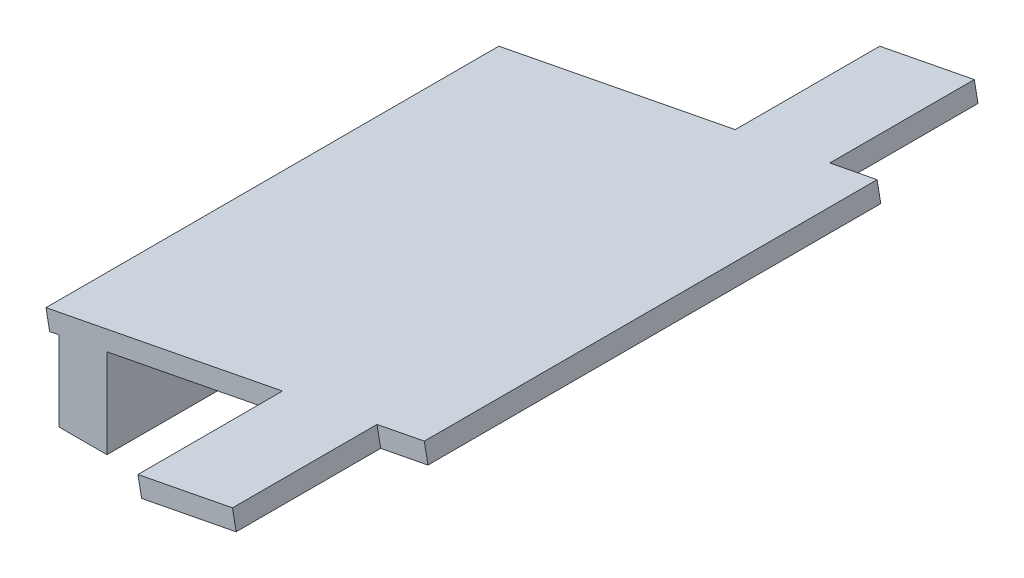
ISO-10303-21;
HEADER;
FILE_DESCRIPTION(('STEP AP214'),'2;1');
FILE_NAME('part.step','',(''),(''),'','','');
FILE_SCHEMA(('AUTOMOTIVE_DESIGN { 1 0 10303 214 1 1 1 1 }'));
ENDSEC;
DATA;
#1=APPLICATION_CONTEXT('core data for automotive mechanical design processes');
#2=APPLICATION_PROTOCOL_DEFINITION('international standard','automotive_design',2000,#1);
#3=PRODUCT_CONTEXT('',#1,'mechanical');
#4=PRODUCT('Part','Part','',(#3));
#5=PRODUCT_RELATED_PRODUCT_CATEGORY('part','',(#4));
#6=PRODUCT_DEFINITION_FORMATION('','',#4);
#7=PRODUCT_DEFINITION_CONTEXT('part definition',#1,'design');
#8=PRODUCT_DEFINITION('design','',#6,#7);
#9=PRODUCT_DEFINITION_SHAPE('','',#8);
#10=(LENGTH_UNIT() NAMED_UNIT(*) SI_UNIT(.MILLI.,.METRE.));
#11=(NAMED_UNIT(*) PLANE_ANGLE_UNIT() SI_UNIT($,.RADIAN.));
#12=(NAMED_UNIT(*) SI_UNIT($,.STERADIAN.) SOLID_ANGLE_UNIT());
#13=UNCERTAINTY_MEASURE_WITH_UNIT(LENGTH_MEASURE(1.E-05),#10,'distance_accuracy_value','');
#14=(GEOMETRIC_REPRESENTATION_CONTEXT(3) GLOBAL_UNCERTAINTY_ASSIGNED_CONTEXT((#13)) GLOBAL_UNIT_ASSIGNED_CONTEXT((#10,
#11,#12)) REPRESENTATION_CONTEXT('',''));
#15=CARTESIAN_POINT('',(0.,0.,0.));
#16=DIRECTION('',(0.,0.,1.));
#17=DIRECTION('',(1.,0.,0.));
#18=AXIS2_PLACEMENT_3D('',#15,#16,#17);
#19=CARTESIAN_POINT('',(-11.9247675422272,-2.08024959402573,-22.7767897226619));
#20=DIRECTION('',(0.,0.,-1.));
#21=DIRECTION('',(-0.98162718344752,-0.190808995377284,0.));
#22=AXIS2_PLACEMENT_3D('',#19,#20,#21);
#23=PLANE('',#22);
#24=DIRECTION('',(0.98162718344752,0.190808995377284,0.));
#25=VECTOR('',#24,1.);
#26=CARTESIAN_POINT('',(-11.5431495514726,-4.04350396092077,-22.7767897226619));
#27=LINE('',#26,#25);
#28=CARTESIAN_POINT('',(22.8138018691906,2.63481087728417,-22.7767897226619));
#29=VERTEX_POINT('',#28);
#30=CARTESIAN_POINT('',(27.7219377864282,3.58885585417059,-22.7767897226618));
#31=VERTEX_POINT('',#30);
#32=EDGE_CURVE('E180',#29,#31,#27,.T.);
#33=ORIENTED_EDGE('',*,*,#32,.F.);
#34=DIRECTION('',(-0.190808995377284,0.98162718344752,0.));
#35=VECTOR('',#34,1.);
#36=CARTESIAN_POINT('',(22.8138018691906,2.63481087728417,-22.7767897226619));
#37=LINE('',#36,#35);
#38=CARTESIAN_POINT('',(22.432183878436,4.5980652441792,-22.7767897226619));
#39=VERTEX_POINT('',#38);
#40=EDGE_CURVE('E171',#29,#39,#37,.T.);
#41=ORIENTED_EDGE('',*,*,#40,.T.);
#42=DIRECTION('',(0.98162718344752,0.190808995377284,0.));
#43=VECTOR('',#42,1.);
#44=CARTESIAN_POINT('',(-11.9247675422272,-2.08024959402573,-22.7767897226619));
#45=LINE('',#44,#43);
#46=CARTESIAN_POINT('',(27.3403197956736,5.55211022106563,-22.7767897226618));
#47=VERTEX_POINT('',#46);
#48=EDGE_CURVE('E195',#39,#47,#45,.T.);
#49=ORIENTED_EDGE('',*,*,#48,.T.);
#50=DIRECTION('',(0.190808995377284,-0.98162718344752,0.));
#51=VECTOR('',#50,1.);
#52=CARTESIAN_POINT('',(27.3403197956736,5.55211022106563,-22.7767897226618));
#53=LINE('',#52,#51);
#54=EDGE_CURVE('E205',#47,#31,#53,.T.);
#55=ORIENTED_EDGE('',*,*,#54,.T.);
#56=EDGE_LOOP('',(#33,#41,#49,#55));
#57=FACE_BOUND('',#56,.T.);
#58=ADVANCED_FACE('F39',(#57),#23,.T.);
#59=CARTESIAN_POINT('',(-11.9247675422272,-2.08024959402573,24.2232102773381));
#60=DIRECTION('',(0.,0.,-1.));
#61=DIRECTION('',(-0.98162718344752,-0.190808995377284,0.));
#62=AXIS2_PLACEMENT_3D('',#59,#60,#61);
#63=PLANE('',#62);
#64=DIRECTION('',(-0.190808995377284,0.98162718344752,0.));
#65=VECTOR('',#64,1.);
#66=CARTESIAN_POINT('',(22.8138018691906,2.63481087728417,24.2232102773381));
#67=LINE('',#66,#65);
#68=CARTESIAN_POINT('',(22.8138018691906,2.63481087728417,24.2232102773381));
#69=VERTEX_POINT('',#68);
#70=CARTESIAN_POINT('',(22.432183878436,4.59806524417921,24.2232102773381));
#71=VERTEX_POINT('',#70);
#72=EDGE_CURVE('E302',#69,#71,#67,.T.);
#73=ORIENTED_EDGE('',*,*,#72,.F.);
#74=DIRECTION('',(0.98162718344752,0.190808995377284,0.));
#75=VECTOR('',#74,1.);
#76=CARTESIAN_POINT('',(-11.5431495514726,-4.04350396092077,24.2232102773381));
#77=LINE('',#76,#75);
#78=CARTESIAN_POINT('',(27.7219377864282,3.58885585417059,24.2232102773381));
#79=VERTEX_POINT('',#78);
#80=EDGE_CURVE('E183',#69,#79,#77,.T.);
#81=ORIENTED_EDGE('',*,*,#80,.T.);
#82=DIRECTION('',(0.190808995377284,-0.98162718344752,0.));
#83=VECTOR('',#82,1.);
#84=CARTESIAN_POINT('',(27.3403197956737,5.55211022106563,24.2232102773381));
#85=LINE('',#84,#83);
#86=CARTESIAN_POINT('',(27.3403197956737,5.55211022106563,24.2232102773381));
#87=VERTEX_POINT('',#86);
#88=EDGE_CURVE('E202',#87,#79,#85,.T.);
#89=ORIENTED_EDGE('',*,*,#88,.F.);
#90=DIRECTION('',(0.98162718344752,0.190808995377284,0.));
#91=VECTOR('',#90,1.);
#92=CARTESIAN_POINT('',(-11.9247675422272,-2.08024959402573,24.2232102773381));
#93=LINE('',#92,#91);
#94=EDGE_CURVE('E251',#71,#87,#93,.T.);
#95=ORIENTED_EDGE('',*,*,#94,.F.);
#96=EDGE_LOOP('',(#73,#81,#89,#95));
#97=FACE_BOUND('',#96,.T.);
#98=ADVANCED_FACE('F267',(#97),#63,.F.);
#99=DIRECTION('',(-0.190808995377284,0.98162718344752,0.));
#100=VECTOR('',#99,1.);
#101=CARTESIAN_POINT('',(12.9975300347154,0.726720923511325,-22.7767897226619));
#102=LINE('',#101,#100);
#103=CARTESIAN_POINT('',(12.9975300347154,0.726720923511325,-22.7767897226619));
#104=VERTEX_POINT('',#103);
#105=CARTESIAN_POINT('',(12.6159120439608,2.68997529040637,-22.7767897226619));
#106=VERTEX_POINT('',#105);
#107=EDGE_CURVE('E155',#104,#106,#102,.T.);
#108=ORIENTED_EDGE('',*,*,#107,.F.);
#109=CARTESIAN_POINT('',(-11.5431495514726,-4.04350396092077,-22.7767897226619));
#110=VERTEX_POINT('',#109);
#111=EDGE_CURVE('E168',#110,#104,#27,.T.);
#112=ORIENTED_EDGE('',*,*,#111,.F.);
#113=DIRECTION('',(0.190808995377284,-0.98162718344752,0.));
#114=VECTOR('',#113,1.);
#115=CARTESIAN_POINT('',(-11.9247675422272,-2.08024959402573,-22.7767897226619));
#116=LINE('',#115,#114);
#117=CARTESIAN_POINT('',(-11.9247675422272,-2.08024959402573,-22.7767897226619));
#118=VERTEX_POINT('',#117);
#119=EDGE_CURVE('E196',#118,#110,#116,.T.);
#120=ORIENTED_EDGE('',*,*,#119,.F.);
#121=EDGE_CURVE('E170',#118,#106,#45,.T.);
#122=ORIENTED_EDGE('',*,*,#121,.T.);
#123=EDGE_LOOP('',(#108,#112,#120,#122));
#124=FACE_BOUND('',#123,.T.);
#125=ADVANCED_FACE('F41',(#124),#23,.T.);
#126=CARTESIAN_POINT('',(-11.9247675422272,-2.08024959402573,-22.7767897226619));
#127=DIRECTION('',(0.98162718344752,0.190808995377284,0.));
#128=DIRECTION('',(0.,0.,-1.));
#129=AXIS2_PLACEMENT_3D('',#126,#127,#128);
#130=PLANE('',#129);
#131=DIRECTION('',(0.,0.,1.));
#132=VECTOR('',#131,1.);
#133=CARTESIAN_POINT('',(-11.5431495514726,-4.04350396092077,-22.7767897226619));
#134=LINE('',#133,#132);
#135=CARTESIAN_POINT('',(-11.5431495514726,-4.04350396092077,24.2232102773381));
#136=VERTEX_POINT('',#135);
#137=EDGE_CURVE('E178',#110,#136,#134,.T.);
#138=ORIENTED_EDGE('',*,*,#137,.T.);
#139=DIRECTION('',(0.190808995377284,-0.98162718344752,0.));
#140=VECTOR('',#139,1.);
#141=CARTESIAN_POINT('',(-11.9247675422272,-2.08024959402573,24.2232102773381));
#142=LINE('',#141,#140);
#143=CARTESIAN_POINT('',(-11.9247675422272,-2.08024959402573,24.2232102773381));
#144=VERTEX_POINT('',#143);
#145=EDGE_CURVE('E199',#144,#136,#142,.T.);
#146=ORIENTED_EDGE('',*,*,#145,.F.);
#147=DIRECTION('',(0.,0.,1.));
#148=VECTOR('',#147,1.);
#149=CARTESIAN_POINT('',(-11.9247675422272,-2.08024959402573,-22.7767897226619));
#150=LINE('',#149,#148);
#151=EDGE_CURVE('E187',#118,#144,#150,.T.);
#152=ORIENTED_EDGE('',*,*,#151,.F.);
#153=ORIENTED_EDGE('',*,*,#119,.T.);
#154=EDGE_LOOP('',(#138,#146,#152,#153));
#155=FACE_BOUND('',#154,.T.);
#156=ADVANCED_FACE('F327',(#155),#130,.F.);
#157=CARTESIAN_POINT('',(-5.59623768797089,-2.8875413944739,24.2232102773381));
#158=VERTEX_POINT('',#157);
#159=CARTESIAN_POINT('',(12.9975300347154,0.726720923511325,24.2232102773381));
#160=VERTEX_POINT('',#159);
#161=EDGE_CURVE('E193',#158,#160,#77,.T.);
#162=ORIENTED_EDGE('',*,*,#161,.T.);
#163=DIRECTION('',(-0.190808995377284,0.98162718344752,0.));
#164=VECTOR('',#163,1.);
#165=CARTESIAN_POINT('',(12.9975300347154,0.726720923511325,24.2232102773381));
#166=LINE('',#165,#164);
#167=CARTESIAN_POINT('',(12.6159120439608,2.68997529040637,24.2232102773381));
#168=VERTEX_POINT('',#167);
#169=EDGE_CURVE('E244',#160,#168,#166,.T.);
#170=ORIENTED_EDGE('',*,*,#169,.T.);
#171=EDGE_CURVE('E252',#144,#168,#93,.T.);
#172=ORIENTED_EDGE('',*,*,#171,.F.);
#173=ORIENTED_EDGE('',*,*,#145,.T.);
#174=CARTESIAN_POINT('',(-10.5962376879709,-3.8594429401664,24.2232102773381));
#175=VERTEX_POINT('',#174);
#176=EDGE_CURVE('E190',#136,#175,#77,.T.);
#177=ORIENTED_EDGE('',*,*,#176,.T.);
#178=DIRECTION('',(0.,-1.,0.));
#179=VECTOR('',#178,1.);
#180=CARTESIAN_POINT('',(-10.5962376879709,-2.13898059054538,24.2232102773381));
#181=LINE('',#180,#179);
#182=CARTESIAN_POINT('',(-10.5962376879709,-12.1389805905454,24.2232102773381));
#183=VERTEX_POINT('',#182);
#184=EDGE_CURVE('E215',#175,#183,#181,.T.);
#185=ORIENTED_EDGE('',*,*,#184,.T.);
#186=DIRECTION('',(1.,0.,0.));
#187=VECTOR('',#186,1.);
#188=CARTESIAN_POINT('',(-5.59623768797089,-12.1389805905454,24.2232102773381));
#189=LINE('',#188,#187);
#190=CARTESIAN_POINT('',(-5.59623768797089,-12.1389805905454,24.2232102773381));
#191=VERTEX_POINT('',#190);
#192=EDGE_CURVE('E234',#183,#191,#189,.T.);
#193=ORIENTED_EDGE('',*,*,#192,.T.);
#194=DIRECTION('',(0.,1.,0.));
#195=VECTOR('',#194,1.);
#196=CARTESIAN_POINT('',(-5.59623768797089,-2.13898059054538,24.2232102773381));
#197=LINE('',#196,#195);
#198=EDGE_CURVE('E232',#191,#158,#197,.T.);
#199=ORIENTED_EDGE('',*,*,#198,.T.);
#200=EDGE_LOOP('',(#162,#170,#172,#173,#177,#185,#193,#199));
#201=FACE_BOUND('',#200,.T.);
#202=ADVANCED_FACE('F326',(#201),#63,.F.);
#203=CARTESIAN_POINT('',(27.3403197956736,5.55211022106563,-22.7767897226618));
#204=DIRECTION('',(0.98162718344752,0.190808995377284,0.));
#205=DIRECTION('',(0.,0.,-1.));
#206=AXIS2_PLACEMENT_3D('',#203,#204,#205);
#207=PLANE('',#206);
#208=DIRECTION('',(0.,0.,1.));
#209=VECTOR('',#208,1.);
#210=CARTESIAN_POINT('',(27.7219377864282,3.58885585417059,-22.7767897226618));
#211=LINE('',#210,#209);
#212=EDGE_CURVE('E179',#31,#79,#211,.T.);
#213=ORIENTED_EDGE('',*,*,#212,.F.);
#214=ORIENTED_EDGE('',*,*,#54,.F.);
#215=DIRECTION('',(0.,0.,1.));
#216=VECTOR('',#215,1.);
#217=CARTESIAN_POINT('',(27.3403197956736,5.55211022106563,-22.7767897226618));
#218=LINE('',#217,#216);
#219=EDGE_CURVE('E249',#47,#87,#218,.T.);
#220=ORIENTED_EDGE('',*,*,#219,.T.);
#221=ORIENTED_EDGE('',*,*,#88,.T.);
#222=EDGE_LOOP('',(#213,#214,#220,#221));
#223=FACE_BOUND('',#222,.T.);
#224=ADVANCED_FACE('F272',(#223),#207,.T.);
#225=CARTESIAN_POINT('',(0.0720534624422166,0.251696181541152,0.));
#226=DIRECTION('',(0.190808995377284,-0.98162718344752,0.));
#227=DIRECTION('',(0.,0.,-1.));
#228=AXIS2_PLACEMENT_3D('',#225,#226,#227);
#229=PLANE('',#228);
#230=ORIENTED_EDGE('',*,*,#121,.F.);
#231=ORIENTED_EDGE('',*,*,#151,.T.);
#232=ORIENTED_EDGE('',*,*,#171,.T.);
#233=DIRECTION('',(0.,0.,1.));
#234=VECTOR('',#233,1.);
#235=CARTESIAN_POINT('',(12.6159120439608,2.68997529040637,24.2232102773381));
#236=LINE('',#235,#234);
#237=CARTESIAN_POINT('',(12.6159120439608,2.68997529040637,39.2232102773381));
#238=VERTEX_POINT('',#237);
#239=EDGE_CURVE('E62',#168,#238,#236,.T.);
#240=ORIENTED_EDGE('',*,*,#239,.T.);
#241=DIRECTION('',(0.98162718344752,0.190808995377284,0.));
#242=VECTOR('',#241,1.);
#243=CARTESIAN_POINT('',(12.6159120439608,2.68997529040637,39.2232102773381));
#244=LINE('',#243,#242);
#245=CARTESIAN_POINT('',(22.432183878436,4.59806524417921,39.2232102773381));
#246=VERTEX_POINT('',#245);
#247=EDGE_CURVE('E298',#238,#246,#244,.T.);
#248=ORIENTED_EDGE('',*,*,#247,.T.);
#249=DIRECTION('',(0.,0.,-1.));
#250=VECTOR('',#249,1.);
#251=CARTESIAN_POINT('',(22.432183878436,4.59806524417921,24.2232102773381));
#252=LINE('',#251,#250);
#253=EDGE_CURVE('E264',#246,#71,#252,.T.);
#254=ORIENTED_EDGE('',*,*,#253,.T.);
#255=ORIENTED_EDGE('',*,*,#94,.T.);
#256=ORIENTED_EDGE('',*,*,#219,.F.);
#257=ORIENTED_EDGE('',*,*,#48,.F.);
#258=DIRECTION('',(0.,0.,-1.));
#259=VECTOR('',#258,1.);
#260=CARTESIAN_POINT('',(22.432183878436,4.59806524417921,-37.7767897226619));
#261=LINE('',#260,#259);
#262=CARTESIAN_POINT('',(22.432183878436,4.59806524417921,-37.7767897226619));
#263=VERTEX_POINT('',#262);
#264=EDGE_CURVE('E54',#39,#263,#261,.T.);
#265=ORIENTED_EDGE('',*,*,#264,.T.);
#266=DIRECTION('',(-0.98162718344752,-0.190808995377284,0.));
#267=VECTOR('',#266,1.);
#268=CARTESIAN_POINT('',(12.6159120439608,2.68997529040637,-37.7767897226619));
#269=LINE('',#268,#267);
#270=CARTESIAN_POINT('',(12.6159120439608,2.68997529040637,-37.7767897226619));
#271=VERTEX_POINT('',#270);
#272=EDGE_CURVE('E163',#263,#271,#269,.T.);
#273=ORIENTED_EDGE('',*,*,#272,.T.);
#274=DIRECTION('',(0.,0.,1.));
#275=VECTOR('',#274,1.);
#276=CARTESIAN_POINT('',(12.6159120439608,2.68997529040637,-37.7767897226619));
#277=LINE('',#276,#275);
#278=EDGE_CURVE('E277',#271,#106,#277,.T.);
#279=ORIENTED_EDGE('',*,*,#278,.T.);
#280=EDGE_LOOP('',(#230,#231,#232,#240,#248,#254,#255,#256,#257,#265,#273,#279));
#281=FACE_BOUND('',#280,.T.);
#282=ADVANCED_FACE('F260',(#281),#229,.F.);
#283=CARTESIAN_POINT('',(0.453671453196784,-1.71155818535389,0.));
#284=DIRECTION('',(0.190808995377284,-0.98162718344752,0.));
#285=DIRECTION('',(0.,0.,-1.));
#286=AXIS2_PLACEMENT_3D('',#283,#284,#285);
#287=PLANE('',#286);
#288=DIRECTION('',(0.,0.,1.));
#289=VECTOR('',#288,1.);
#290=CARTESIAN_POINT('',(-5.59623768797089,-2.8875413944739,0.));
#291=LINE('',#290,#289);
#292=CARTESIAN_POINT('',(-5.59623768797089,-2.8875413944739,-22.2767897226619));
#293=VERTEX_POINT('',#292);
#294=EDGE_CURVE('E11',#293,#158,#291,.T.);
#295=ORIENTED_EDGE('',*,*,#294,.F.);
#296=DIRECTION('',(0.98162718344752,0.190808995377284,0.));
#297=VECTOR('',#296,1.);
#298=CARTESIAN_POINT('',(0.453671453196784,-1.71155818535389,-22.2767897226619));
#299=LINE('',#298,#297);
#300=CARTESIAN_POINT('',(-10.5962376879709,-3.8594429401664,-22.2767897226619));
#301=VERTEX_POINT('',#300);
#302=EDGE_CURVE('E198',#301,#293,#299,.T.);
#303=ORIENTED_EDGE('',*,*,#302,.F.);
#304=DIRECTION('',(0.,0.,-1.));
#305=VECTOR('',#304,1.);
#306=CARTESIAN_POINT('',(-10.5962376879709,-3.8594429401664,0.));
#307=LINE('',#306,#305);
#308=EDGE_CURVE('E47',#175,#301,#307,.T.);
#309=ORIENTED_EDGE('',*,*,#308,.F.);
#310=ORIENTED_EDGE('',*,*,#176,.F.);
#311=ORIENTED_EDGE('',*,*,#137,.F.);
#312=ORIENTED_EDGE('',*,*,#111,.T.);
#313=DIRECTION('',(0.,0.,1.));
#314=VECTOR('',#313,1.);
#315=CARTESIAN_POINT('',(12.9975300347154,0.726720923511325,-37.7767897226619));
#316=LINE('',#315,#314);
#317=CARTESIAN_POINT('',(12.9975300347154,0.726720923511325,-37.7767897226619));
#318=VERTEX_POINT('',#317);
#319=EDGE_CURVE('E151',#318,#104,#316,.T.);
#320=ORIENTED_EDGE('',*,*,#319,.F.);
#321=DIRECTION('',(-0.98162718344752,-0.190808995377284,0.));
#322=VECTOR('',#321,1.);
#323=CARTESIAN_POINT('',(12.9975300347154,0.726720923511325,-37.7767897226619));
#324=LINE('',#323,#322);
#325=CARTESIAN_POINT('',(22.8138018691906,2.63481087728417,-37.7767897226619));
#326=VERTEX_POINT('',#325);
#327=EDGE_CURVE('E172',#326,#318,#324,.T.);
#328=ORIENTED_EDGE('',*,*,#327,.F.);
#329=DIRECTION('',(0.,0.,-1.));
#330=VECTOR('',#329,1.);
#331=CARTESIAN_POINT('',(22.8138018691906,2.63481087728417,-37.7767897226619));
#332=LINE('',#331,#330);
#333=EDGE_CURVE('E162',#29,#326,#332,.T.);
#334=ORIENTED_EDGE('',*,*,#333,.F.);
#335=ORIENTED_EDGE('',*,*,#32,.T.);
#336=ORIENTED_EDGE('',*,*,#212,.T.);
#337=ORIENTED_EDGE('',*,*,#80,.F.);
#338=DIRECTION('',(0.,0.,-1.));
#339=VECTOR('',#338,1.);
#340=CARTESIAN_POINT('',(22.8138018691906,2.63481087728417,24.2232102773381));
#341=LINE('',#340,#339);
#342=CARTESIAN_POINT('',(22.8138018691906,2.63481087728417,39.2232102773381));
#343=VERTEX_POINT('',#342);
#344=EDGE_CURVE('E295',#343,#69,#341,.T.);
#345=ORIENTED_EDGE('',*,*,#344,.F.);
#346=DIRECTION('',(0.98162718344752,0.190808995377284,0.));
#347=VECTOR('',#346,1.);
#348=CARTESIAN_POINT('',(12.9975300347154,0.726720923511326,39.2232102773381));
#349=LINE('',#348,#347);
#350=CARTESIAN_POINT('',(12.9975300347154,0.726720923511326,39.2232102773381));
#351=VERTEX_POINT('',#350);
#352=EDGE_CURVE('E292',#351,#343,#349,.T.);
#353=ORIENTED_EDGE('',*,*,#352,.F.);
#354=DIRECTION('',(0.,0.,1.));
#355=VECTOR('',#354,1.);
#356=CARTESIAN_POINT('',(12.9975300347154,0.726720923511325,24.2232102773381));
#357=LINE('',#356,#355);
#358=EDGE_CURVE('E289',#160,#351,#357,.T.);
#359=ORIENTED_EDGE('',*,*,#358,.F.);
#360=ORIENTED_EDGE('',*,*,#161,.F.);
#361=EDGE_LOOP('',(#295,#303,#309,#310,#311,#312,#320,#328,#334,#335,#336,#337,#345,#353,#359,#360));
#362=FACE_BOUND('',#361,.T.);
#363=ADVANCED_FACE('F176',(#362),#287,.T.);
#364=CARTESIAN_POINT('',(-5.59623768797089,-2.13898059054538,-22.2767897226619));
#365=DIRECTION('',(1.,0.,0.));
#366=DIRECTION('',(0.,1.,0.));
#367=AXIS2_PLACEMENT_3D('',#364,#365,#366);
#368=PLANE('',#367);
#369=DIRECTION('',(0.,1.,0.));
#370=VECTOR('',#369,1.);
#371=CARTESIAN_POINT('',(-5.59623768797089,-2.13898059054538,-22.2767897226619));
#372=LINE('',#371,#370);
#373=CARTESIAN_POINT('',(-5.59623768797089,-12.1389805905454,-22.2767897226619));
#374=VERTEX_POINT('',#373);
#375=EDGE_CURVE('E224',#374,#293,#372,.T.);
#376=ORIENTED_EDGE('',*,*,#375,.T.);
#377=ORIENTED_EDGE('',*,*,#294,.T.);
#378=ORIENTED_EDGE('',*,*,#198,.F.);
#379=DIRECTION('',(0.,0.,1.));
#380=VECTOR('',#379,1.);
#381=CARTESIAN_POINT('',(-5.59623768797089,-12.1389805905454,-22.2767897226619));
#382=LINE('',#381,#380);
#383=EDGE_CURVE('E185',#374,#191,#382,.T.);
#384=ORIENTED_EDGE('',*,*,#383,.F.);
#385=EDGE_LOOP('',(#376,#377,#378,#384));
#386=FACE_BOUND('',#385,.T.);
#387=ADVANCED_FACE('F231',(#386),#368,.T.);
#388=CARTESIAN_POINT('',(-5.59623768797089,-12.1389805905454,-22.2767897226619));
#389=DIRECTION('',(0.,-1.,0.));
#390=DIRECTION('',(0.,0.,-1.));
#391=AXIS2_PLACEMENT_3D('',#388,#389,#390);
#392=PLANE('',#391);
#393=ORIENTED_EDGE('',*,*,#192,.F.);
#394=DIRECTION('',(0.,0.,1.));
#395=VECTOR('',#394,1.);
#396=CARTESIAN_POINT('',(-10.5962376879709,-12.1389805905454,-22.2767897226619));
#397=LINE('',#396,#395);
#398=CARTESIAN_POINT('',(-10.5962376879709,-12.1389805905454,-22.2767897226619));
#399=VERTEX_POINT('',#398);
#400=EDGE_CURVE('E242',#399,#183,#397,.T.);
#401=ORIENTED_EDGE('',*,*,#400,.F.);
#402=DIRECTION('',(1.,0.,0.));
#403=VECTOR('',#402,1.);
#404=CARTESIAN_POINT('',(-5.59623768797089,-12.1389805905454,-22.2767897226619));
#405=LINE('',#404,#403);
#406=EDGE_CURVE('E223',#399,#374,#405,.T.);
#407=ORIENTED_EDGE('',*,*,#406,.T.);
#408=ORIENTED_EDGE('',*,*,#383,.T.);
#409=EDGE_LOOP('',(#393,#401,#407,#408));
#410=FACE_BOUND('',#409,.T.);
#411=ADVANCED_FACE('F349',(#410),#392,.T.);
#412=CARTESIAN_POINT('',(-10.5962376879709,-2.13898059054538,-22.2767897226619));
#413=DIRECTION('',(-1.,0.,0.));
#414=DIRECTION('',(0.,-1.,0.));
#415=AXIS2_PLACEMENT_3D('',#412,#413,#414);
#416=PLANE('',#415);
#417=ORIENTED_EDGE('',*,*,#184,.F.);
#418=ORIENTED_EDGE('',*,*,#308,.T.);
#419=DIRECTION('',(0.,-1.,0.));
#420=VECTOR('',#419,1.);
#421=CARTESIAN_POINT('',(-10.5962376879709,-2.13898059054538,-22.2767897226619));
#422=LINE('',#421,#420);
#423=EDGE_CURVE('E213',#301,#399,#422,.T.);
#424=ORIENTED_EDGE('',*,*,#423,.T.);
#425=ORIENTED_EDGE('',*,*,#400,.T.);
#426=EDGE_LOOP('',(#417,#418,#424,#425));
#427=FACE_BOUND('',#426,.T.);
#428=ADVANCED_FACE('F211',(#427),#416,.T.);
#429=CARTESIAN_POINT('',(0.,0.,-22.2767897226619));
#430=DIRECTION('',(0.,0.,-1.));
#431=DIRECTION('',(-1.,0.,0.));
#432=AXIS2_PLACEMENT_3D('',#429,#430,#431);
#433=PLANE('',#432);
#434=ORIENTED_EDGE('',*,*,#423,.F.);
#435=ORIENTED_EDGE('',*,*,#302,.T.);
#436=ORIENTED_EDGE('',*,*,#375,.F.);
#437=ORIENTED_EDGE('',*,*,#406,.F.);
#438=EDGE_LOOP('',(#434,#435,#436,#437));
#439=FACE_BOUND('',#438,.T.);
#440=ADVANCED_FACE('F219',(#439),#433,.T.);
#441=CARTESIAN_POINT('',(12.9975300347154,0.726720923511325,24.2232102773381));
#442=DIRECTION('',(-0.98162718344752,-0.190808995377284,0.));
#443=DIRECTION('',(0.190808995377284,-0.98162718344752,0.));
#444=AXIS2_PLACEMENT_3D('',#441,#442,#443);
#445=PLANE('',#444);
#446=ORIENTED_EDGE('',*,*,#239,.F.);
#447=ORIENTED_EDGE('',*,*,#169,.F.);
#448=ORIENTED_EDGE('',*,*,#358,.T.);
#449=DIRECTION('',(-0.190808995377284,0.98162718344752,0.));
#450=VECTOR('',#449,1.);
#451=CARTESIAN_POINT('',(12.9975300347154,0.726720923511326,39.2232102773381));
#452=LINE('',#451,#450);
#453=EDGE_CURVE('E238',#351,#238,#452,.T.);
#454=ORIENTED_EDGE('',*,*,#453,.T.);
#455=EDGE_LOOP('',(#446,#447,#448,#454));
#456=FACE_BOUND('',#455,.T.);
#457=ADVANCED_FACE('F306',(#456),#445,.T.);
#458=CARTESIAN_POINT('',(22.8138018691906,2.63481087728417,24.2232102773381));
#459=DIRECTION('',(0.98162718344752,0.190808995377284,0.));
#460=DIRECTION('',(-0.190808995377284,0.98162718344752,0.));
#461=AXIS2_PLACEMENT_3D('',#458,#459,#460);
#462=PLANE('',#461);
#463=ORIENTED_EDGE('',*,*,#253,.F.);
#464=DIRECTION('',(-0.190808995377284,0.98162718344752,0.));
#465=VECTOR('',#464,1.);
#466=CARTESIAN_POINT('',(22.8138018691906,2.63481087728417,39.2232102773381));
#467=LINE('',#466,#465);
#468=EDGE_CURVE('E303',#343,#246,#467,.T.);
#469=ORIENTED_EDGE('',*,*,#468,.F.);
#470=ORIENTED_EDGE('',*,*,#344,.T.);
#471=ORIENTED_EDGE('',*,*,#72,.T.);
#472=EDGE_LOOP('',(#463,#469,#470,#471));
#473=FACE_BOUND('',#472,.T.);
#474=ADVANCED_FACE('F310',(#473),#462,.T.);
#475=CARTESIAN_POINT('',(12.9975300347154,0.726720923511326,39.2232102773381));
#476=DIRECTION('',(0.,0.,1.));
#477=DIRECTION('',(1.,0.,0.));
#478=AXIS2_PLACEMENT_3D('',#475,#476,#477);
#479=PLANE('',#478);
#480=ORIENTED_EDGE('',*,*,#247,.F.);
#481=ORIENTED_EDGE('',*,*,#453,.F.);
#482=ORIENTED_EDGE('',*,*,#352,.T.);
#483=ORIENTED_EDGE('',*,*,#468,.T.);
#484=EDGE_LOOP('',(#480,#481,#482,#483));
#485=FACE_BOUND('',#484,.T.);
#486=ADVANCED_FACE('F308',(#485),#479,.T.);
#487=CARTESIAN_POINT('',(12.9975300347154,0.726720923511325,-37.7767897226619));
#488=DIRECTION('',(-0.98162718344752,-0.190808995377284,0.));
#489=DIRECTION('',(0.190808995377284,-0.98162718344752,0.));
#490=AXIS2_PLACEMENT_3D('',#487,#488,#489);
#491=PLANE('',#490);
#492=ORIENTED_EDGE('',*,*,#278,.F.);
#493=DIRECTION('',(-0.190808995377284,0.98162718344752,0.));
#494=VECTOR('',#493,1.);
#495=CARTESIAN_POINT('',(12.9975300347154,0.726720923511325,-37.7767897226619));
#496=LINE('',#495,#494);
#497=EDGE_CURVE('E157',#318,#271,#496,.T.);
#498=ORIENTED_EDGE('',*,*,#497,.F.);
#499=ORIENTED_EDGE('',*,*,#319,.T.);
#500=ORIENTED_EDGE('',*,*,#107,.T.);
#501=EDGE_LOOP('',(#492,#498,#499,#500));
#502=FACE_BOUND('',#501,.T.);
#503=ADVANCED_FACE('F154',(#502),#491,.T.);
#504=CARTESIAN_POINT('',(12.9975300347154,0.726720923511325,-37.7767897226619));
#505=DIRECTION('',(0.,0.,-1.));
#506=DIRECTION('',(-1.,0.,0.));
#507=AXIS2_PLACEMENT_3D('',#504,#505,#506);
#508=PLANE('',#507);
#509=ORIENTED_EDGE('',*,*,#272,.F.);
#510=DIRECTION('',(-0.190808995377284,0.98162718344752,0.));
#511=VECTOR('',#510,1.);
#512=CARTESIAN_POINT('',(22.8138018691906,2.63481087728417,-37.7767897226619));
#513=LINE('',#512,#511);
#514=EDGE_CURVE('E281',#326,#263,#513,.T.);
#515=ORIENTED_EDGE('',*,*,#514,.F.);
#516=ORIENTED_EDGE('',*,*,#327,.T.);
#517=ORIENTED_EDGE('',*,*,#497,.T.);
#518=EDGE_LOOP('',(#509,#515,#516,#517));
#519=FACE_BOUND('',#518,.T.);
#520=ADVANCED_FACE('F280',(#519),#508,.T.);
#521=CARTESIAN_POINT('',(22.8138018691906,2.63481087728417,-37.7767897226619));
#522=DIRECTION('',(0.98162718344752,0.190808995377284,0.));
#523=DIRECTION('',(-0.190808995377284,0.98162718344752,0.));
#524=AXIS2_PLACEMENT_3D('',#521,#522,#523);
#525=PLANE('',#524);
#526=ORIENTED_EDGE('',*,*,#264,.F.);
#527=ORIENTED_EDGE('',*,*,#40,.F.);
#528=ORIENTED_EDGE('',*,*,#333,.T.);
#529=ORIENTED_EDGE('',*,*,#514,.T.);
#530=EDGE_LOOP('',(#526,#527,#528,#529));
#531=FACE_BOUND('',#530,.T.);
#532=ADVANCED_FACE('F405',(#531),#525,.T.);
#533=CLOSED_SHELL('',(#58,#98,#125,#156,#202,#224,#282,#363,#387,#411,#428,#440,#457,#474,#486,
#503,#520,#532));
#534=MANIFOLD_SOLID_BREP('B2',#533);
#535=ADVANCED_BREP_SHAPE_REPRESENTATION('',(#18,#534),#14);
#536=SHAPE_DEFINITION_REPRESENTATION(#9,#535);
ENDSEC;
END-ISO-10303-21;
